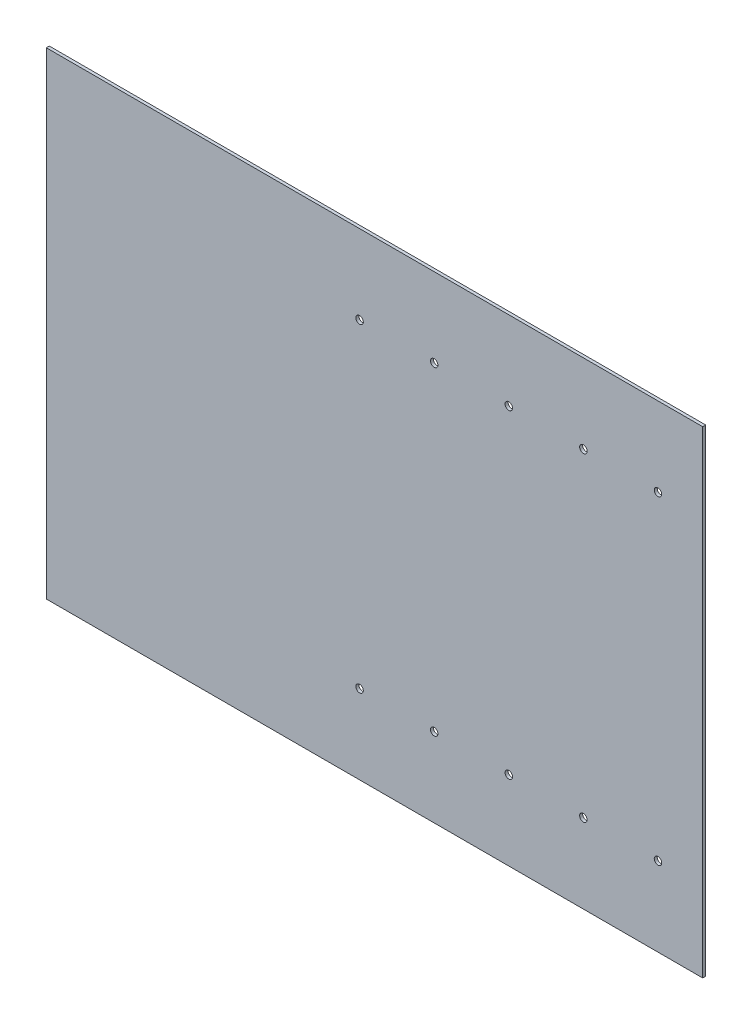
ISO-10303-21;
HEADER;
FILE_DESCRIPTION(('STEP AP214'),'2;1');
FILE_NAME('part.step','',(''),(''),'','','');
FILE_SCHEMA(('AUTOMOTIVE_DESIGN { 1 0 10303 214 1 1 1 1 }'));
ENDSEC;
DATA;
#1=APPLICATION_CONTEXT('core data for automotive mechanical design processes');
#2=APPLICATION_PROTOCOL_DEFINITION('international standard','automotive_design',2000,#1);
#3=PRODUCT_CONTEXT('',#1,'mechanical');
#4=PRODUCT('Part','Part','',(#3));
#5=PRODUCT_RELATED_PRODUCT_CATEGORY('part','',(#4));
#6=PRODUCT_DEFINITION_FORMATION('','',#4);
#7=PRODUCT_DEFINITION_CONTEXT('part definition',#1,'design');
#8=PRODUCT_DEFINITION('design','',#6,#7);
#9=PRODUCT_DEFINITION_SHAPE('','',#8);
#10=(LENGTH_UNIT() NAMED_UNIT(*) SI_UNIT(.MILLI.,.METRE.));
#11=(NAMED_UNIT(*) PLANE_ANGLE_UNIT() SI_UNIT($,.RADIAN.));
#12=(NAMED_UNIT(*) SI_UNIT($,.STERADIAN.) SOLID_ANGLE_UNIT());
#13=UNCERTAINTY_MEASURE_WITH_UNIT(LENGTH_MEASURE(1.E-05),#10,'distance_accuracy_value','');
#14=(GEOMETRIC_REPRESENTATION_CONTEXT(3) GLOBAL_UNCERTAINTY_ASSIGNED_CONTEXT((#13)) GLOBAL_UNIT_ASSIGNED_CONTEXT((#10,
#11,#12)) REPRESENTATION_CONTEXT('',''));
#15=CARTESIAN_POINT('',(0.,0.,0.));
#16=DIRECTION('',(0.,0.,1.));
#17=DIRECTION('',(1.,0.,0.));
#18=AXIS2_PLACEMENT_3D('',#15,#16,#17);
#19=CARTESIAN_POINT('',(220.,160.,2.));
#20=DIRECTION('',(-1.,0.,0.));
#21=DIRECTION('',(0.,-1.,0.));
#22=AXIS2_PLACEMENT_3D('',#19,#20,#21);
#23=PLANE('',#22);
#24=DIRECTION('',(0.,1.,0.));
#25=VECTOR('',#24,1.);
#26=CARTESIAN_POINT('',(220.,160.,0.));
#27=LINE('',#26,#25);
#28=CARTESIAN_POINT('',(220.,-160.,0.));
#29=VERTEX_POINT('',#28);
#30=CARTESIAN_POINT('',(220.,160.,0.));
#31=VERTEX_POINT('',#30);
#32=EDGE_CURVE('E110',#29,#31,#27,.T.);
#33=ORIENTED_EDGE('',*,*,#32,.T.);
#34=DIRECTION('',(0.,0.,-1.));
#35=VECTOR('',#34,1.);
#36=CARTESIAN_POINT('',(220.,160.,2.));
#37=LINE('',#36,#35);
#38=CARTESIAN_POINT('',(220.,160.,2.));
#39=VERTEX_POINT('',#38);
#40=EDGE_CURVE('E11',#39,#31,#37,.T.);
#41=ORIENTED_EDGE('',*,*,#40,.F.);
#42=DIRECTION('',(0.,1.,0.));
#43=VECTOR('',#42,1.);
#44=CARTESIAN_POINT('',(220.,160.,2.));
#45=LINE('',#44,#43);
#46=CARTESIAN_POINT('',(220.,-160.,2.));
#47=VERTEX_POINT('',#46);
#48=EDGE_CURVE('E93',#47,#39,#45,.T.);
#49=ORIENTED_EDGE('',*,*,#48,.F.);
#50=DIRECTION('',(0.,0.,-1.));
#51=VECTOR('',#50,1.);
#52=CARTESIAN_POINT('',(220.,-160.,2.));
#53=LINE('',#52,#51);
#54=EDGE_CURVE('E106',#47,#29,#53,.T.);
#55=ORIENTED_EDGE('',*,*,#54,.T.);
#56=EDGE_LOOP('',(#33,#41,#49,#55));
#57=FACE_BOUND('',#56,.T.);
#58=ADVANCED_FACE('F39',(#57),#23,.F.);
#59=CARTESIAN_POINT('',(-220.,160.,2.));
#60=DIRECTION('',(0.,-1.,0.));
#61=DIRECTION('',(0.,0.,-1.));
#62=AXIS2_PLACEMENT_3D('',#59,#60,#61);
#63=PLANE('',#62);
#64=DIRECTION('',(-1.,0.,0.));
#65=VECTOR('',#64,1.);
#66=CARTESIAN_POINT('',(-220.,160.,0.));
#67=LINE('',#66,#65);
#68=CARTESIAN_POINT('',(-220.,160.,0.));
#69=VERTEX_POINT('',#68);
#70=EDGE_CURVE('E98',#31,#69,#67,.T.);
#71=ORIENTED_EDGE('',*,*,#70,.T.);
#72=DIRECTION('',(0.,0.,-1.));
#73=VECTOR('',#72,1.);
#74=CARTESIAN_POINT('',(-220.,160.,2.));
#75=LINE('',#74,#73);
#76=CARTESIAN_POINT('',(-220.,160.,2.));
#77=VERTEX_POINT('',#76);
#78=EDGE_CURVE('E49',#77,#69,#75,.T.);
#79=ORIENTED_EDGE('',*,*,#78,.F.);
#80=DIRECTION('',(-1.,0.,0.));
#81=VECTOR('',#80,1.);
#82=CARTESIAN_POINT('',(-220.,160.,2.));
#83=LINE('',#82,#81);
#84=EDGE_CURVE('E88',#39,#77,#83,.T.);
#85=ORIENTED_EDGE('',*,*,#84,.F.);
#86=ORIENTED_EDGE('',*,*,#40,.T.);
#87=EDGE_LOOP('',(#71,#79,#85,#86));
#88=FACE_BOUND('',#87,.T.);
#89=ADVANCED_FACE('F97',(#88),#63,.F.);
#90=CARTESIAN_POINT('',(-220.,160.,2.));
#91=DIRECTION('',(1.,0.,0.));
#92=DIRECTION('',(0.,0.,-1.));
#93=AXIS2_PLACEMENT_3D('',#90,#91,#92);
#94=PLANE('',#93);
#95=DIRECTION('',(0.,-1.,0.));
#96=VECTOR('',#95,1.);
#97=CARTESIAN_POINT('',(-220.,160.,0.));
#98=LINE('',#97,#96);
#99=CARTESIAN_POINT('',(-220.,-160.,0.));
#100=VERTEX_POINT('',#99);
#101=EDGE_CURVE('E75',#69,#100,#98,.T.);
#102=ORIENTED_EDGE('',*,*,#101,.T.);
#103=DIRECTION('',(0.,0.,-1.));
#104=VECTOR('',#103,1.);
#105=CARTESIAN_POINT('',(-220.,-160.,2.));
#106=LINE('',#105,#104);
#107=CARTESIAN_POINT('',(-220.,-160.,2.));
#108=VERTEX_POINT('',#107);
#109=EDGE_CURVE('E100',#108,#100,#106,.T.);
#110=ORIENTED_EDGE('',*,*,#109,.F.);
#111=DIRECTION('',(0.,-1.,0.));
#112=VECTOR('',#111,1.);
#113=CARTESIAN_POINT('',(-220.,160.,2.));
#114=LINE('',#113,#112);
#115=EDGE_CURVE('E91',#77,#108,#114,.T.);
#116=ORIENTED_EDGE('',*,*,#115,.F.);
#117=ORIENTED_EDGE('',*,*,#78,.T.);
#118=EDGE_LOOP('',(#102,#110,#116,#117));
#119=FACE_BOUND('',#118,.T.);
#120=ADVANCED_FACE('F102',(#119),#94,.F.);
#121=CARTESIAN_POINT('',(-220.,-160.,2.));
#122=DIRECTION('',(0.,1.,0.));
#123=DIRECTION('',(0.,0.,1.));
#124=AXIS2_PLACEMENT_3D('',#121,#122,#123);
#125=PLANE('',#124);
#126=DIRECTION('',(1.,0.,0.));
#127=VECTOR('',#126,1.);
#128=CARTESIAN_POINT('',(-220.,-160.,0.));
#129=LINE('',#128,#127);
#130=EDGE_CURVE('E81',#100,#29,#129,.T.);
#131=ORIENTED_EDGE('',*,*,#130,.T.);
#132=ORIENTED_EDGE('',*,*,#54,.F.);
#133=DIRECTION('',(1.,0.,0.));
#134=VECTOR('',#133,1.);
#135=CARTESIAN_POINT('',(-220.,-160.,2.));
#136=LINE('',#135,#134);
#137=EDGE_CURVE('E58',#108,#47,#136,.T.);
#138=ORIENTED_EDGE('',*,*,#137,.F.);
#139=ORIENTED_EDGE('',*,*,#109,.T.);
#140=EDGE_LOOP('',(#131,#132,#138,#139));
#141=FACE_BOUND('',#140,.T.);
#142=ADVANCED_FACE('F196',(#141),#125,.F.);
#143=CARTESIAN_POINT('',(0.,0.,2.));
#144=DIRECTION('',(0.,0.,1.));
#145=DIRECTION('',(1.,0.,0.));
#146=AXIS2_PLACEMENT_3D('',#143,#144,#145);
#147=PLANE('',#146);
#148=CARTESIAN_POINT('',(190.,-107.000000000001,2.));
#149=DIRECTION('',(0.,0.,1.));
#150=DIRECTION('',(-1.,0.,0.));
#151=AXIS2_PLACEMENT_3D('',#148,#149,#150);
#152=CIRCLE('',#151,2.5);
#153=CARTESIAN_POINT('',(187.5,-107.000000000001,2.));
#154=VERTEX_POINT('',#153);
#155=EDGE_CURVE('E345',#154,#154,#152,.T.);
#156=ORIENTED_EDGE('',*,*,#155,.F.);
#157=EDGE_LOOP('',(#156));
#158=FACE_BOUND('',#157,.T.);
#159=CARTESIAN_POINT('',(140.,-107.000000000001,2.));
#160=DIRECTION('',(0.,0.,1.));
#161=DIRECTION('',(-1.,0.,0.));
#162=AXIS2_PLACEMENT_3D('',#159,#160,#161);
#163=CIRCLE('',#162,2.5);
#164=CARTESIAN_POINT('',(137.5,-107.000000000001,2.));
#165=VERTEX_POINT('',#164);
#166=EDGE_CURVE('E337',#165,#165,#163,.T.);
#167=ORIENTED_EDGE('',*,*,#166,.F.);
#168=EDGE_LOOP('',(#167));
#169=FACE_BOUND('',#168,.T.);
#170=CARTESIAN_POINT('',(90.,-107.000000000001,2.));
#171=DIRECTION('',(0.,0.,1.));
#172=DIRECTION('',(-1.,0.,0.));
#173=AXIS2_PLACEMENT_3D('',#170,#171,#172);
#174=CIRCLE('',#173,2.5);
#175=CARTESIAN_POINT('',(87.5,-107.000000000001,2.));
#176=VERTEX_POINT('',#175);
#177=EDGE_CURVE('E310',#176,#176,#174,.T.);
#178=ORIENTED_EDGE('',*,*,#177,.F.);
#179=EDGE_LOOP('',(#178));
#180=FACE_BOUND('',#179,.T.);
#181=CARTESIAN_POINT('',(40.,-107.,2.));
#182=DIRECTION('',(0.,0.,1.));
#183=DIRECTION('',(-1.,0.,0.));
#184=AXIS2_PLACEMENT_3D('',#181,#182,#183);
#185=CIRCLE('',#184,2.5);
#186=CARTESIAN_POINT('',(37.5,-107.,2.));
#187=VERTEX_POINT('',#186);
#188=EDGE_CURVE('E336',#187,#187,#185,.T.);
#189=ORIENTED_EDGE('',*,*,#188,.F.);
#190=EDGE_LOOP('',(#189));
#191=FACE_BOUND('',#190,.T.);
#192=CARTESIAN_POINT('',(-10.,-107.,2.));
#193=DIRECTION('',(0.,0.,1.));
#194=DIRECTION('',(-1.,0.,0.));
#195=AXIS2_PLACEMENT_3D('',#192,#193,#194);
#196=CIRCLE('',#195,2.5);
#197=CARTESIAN_POINT('',(-12.5,-107.,2.));
#198=VERTEX_POINT('',#197);
#199=EDGE_CURVE('E342',#198,#198,#196,.T.);
#200=ORIENTED_EDGE('',*,*,#199,.F.);
#201=EDGE_LOOP('',(#200));
#202=FACE_BOUND('',#201,.T.);
#203=CARTESIAN_POINT('',(-10.,107.,2.));
#204=DIRECTION('',(0.,0.,1.));
#205=DIRECTION('',(1.,0.,0.));
#206=AXIS2_PLACEMENT_3D('',#203,#204,#205);
#207=CIRCLE('',#206,2.5);
#208=CARTESIAN_POINT('',(-7.50000000000001,107.,2.));
#209=VERTEX_POINT('',#208);
#210=EDGE_CURVE('E369',#209,#209,#207,.T.);
#211=ORIENTED_EDGE('',*,*,#210,.F.);
#212=EDGE_LOOP('',(#211));
#213=FACE_BOUND('',#212,.T.);
#214=CARTESIAN_POINT('',(40.,107.,2.));
#215=DIRECTION('',(0.,0.,1.));
#216=DIRECTION('',(1.,0.,0.));
#217=AXIS2_PLACEMENT_3D('',#214,#215,#216);
#218=CIRCLE('',#217,2.5);
#219=CARTESIAN_POINT('',(42.5,107.,2.));
#220=VERTEX_POINT('',#219);
#221=EDGE_CURVE('E363',#220,#220,#218,.T.);
#222=ORIENTED_EDGE('',*,*,#221,.F.);
#223=EDGE_LOOP('',(#222));
#224=FACE_BOUND('',#223,.T.);
#225=CARTESIAN_POINT('',(90.,107.000000000001,2.));
#226=DIRECTION('',(0.,0.,1.));
#227=DIRECTION('',(1.,0.,0.));
#228=AXIS2_PLACEMENT_3D('',#225,#226,#227);
#229=CIRCLE('',#228,2.5);
#230=CARTESIAN_POINT('',(92.5,107.000000000001,2.));
#231=VERTEX_POINT('',#230);
#232=EDGE_CURVE('E358',#231,#231,#229,.T.);
#233=ORIENTED_EDGE('',*,*,#232,.F.);
#234=EDGE_LOOP('',(#233));
#235=FACE_BOUND('',#234,.T.);
#236=CARTESIAN_POINT('',(140.,107.000000000001,2.));
#237=DIRECTION('',(0.,0.,1.));
#238=DIRECTION('',(1.,0.,0.));
#239=AXIS2_PLACEMENT_3D('',#236,#237,#238);
#240=CIRCLE('',#239,2.5);
#241=CARTESIAN_POINT('',(142.5,107.000000000001,2.));
#242=VERTEX_POINT('',#241);
#243=EDGE_CURVE('E353',#242,#242,#240,.T.);
#244=ORIENTED_EDGE('',*,*,#243,.F.);
#245=EDGE_LOOP('',(#244));
#246=FACE_BOUND('',#245,.T.);
#247=CARTESIAN_POINT('',(190.,107.000000000001,2.));
#248=DIRECTION('',(0.,0.,1.));
#249=DIRECTION('',(1.,0.,0.));
#250=AXIS2_PLACEMENT_3D('',#247,#248,#249);
#251=CIRCLE('',#250,2.49999999999994);
#252=CARTESIAN_POINT('',(192.5,107.000000000001,2.));
#253=VERTEX_POINT('',#252);
#254=EDGE_CURVE('E129',#253,#253,#251,.T.);
#255=ORIENTED_EDGE('',*,*,#254,.F.);
#256=EDGE_LOOP('',(#255));
#257=FACE_BOUND('',#256,.T.);
#258=ORIENTED_EDGE('',*,*,#48,.T.);
#259=ORIENTED_EDGE('',*,*,#84,.T.);
#260=ORIENTED_EDGE('',*,*,#115,.T.);
#261=ORIENTED_EDGE('',*,*,#137,.T.);
#262=EDGE_LOOP('',(#258,#259,#260,#261));
#263=FACE_BOUND('',#262,.T.);
#264=ADVANCED_FACE('F89',(#158,#169,#180,#191,#202,#213,#224,#235,#246,#257,#263),#147,.T.);
#265=CARTESIAN_POINT('',(0.,0.,0.));
#266=DIRECTION('',(0.,0.,1.));
#267=DIRECTION('',(1.,0.,0.));
#268=AXIS2_PLACEMENT_3D('',#265,#266,#267);
#269=PLANE('',#268);
#270=CARTESIAN_POINT('',(190.,-107.000000000001,0.));
#271=DIRECTION('',(0.,0.,1.));
#272=DIRECTION('',(1.,0.,0.));
#273=AXIS2_PLACEMENT_3D('',#270,#271,#272);
#274=CIRCLE('',#273,2.5);
#275=CARTESIAN_POINT('',(192.5,-107.000000000001,0.));
#276=VERTEX_POINT('',#275);
#277=EDGE_CURVE('E42',#276,#276,#274,.T.);
#278=ORIENTED_EDGE('',*,*,#277,.T.);
#279=EDGE_LOOP('',(#278));
#280=FACE_BOUND('',#279,.T.);
#281=CARTESIAN_POINT('',(140.,-107.000000000001,0.));
#282=DIRECTION('',(0.,0.,1.));
#283=DIRECTION('',(1.,0.,0.));
#284=AXIS2_PLACEMENT_3D('',#281,#282,#283);
#285=CIRCLE('',#284,2.5);
#286=CARTESIAN_POINT('',(142.5,-107.000000000001,0.));
#287=VERTEX_POINT('',#286);
#288=EDGE_CURVE('E156',#287,#287,#285,.T.);
#289=ORIENTED_EDGE('',*,*,#288,.T.);
#290=EDGE_LOOP('',(#289));
#291=FACE_BOUND('',#290,.T.);
#292=CARTESIAN_POINT('',(90.,-107.000000000001,0.));
#293=DIRECTION('',(0.,0.,1.));
#294=DIRECTION('',(1.,0.,0.));
#295=AXIS2_PLACEMENT_3D('',#292,#293,#294);
#296=CIRCLE('',#295,2.5);
#297=CARTESIAN_POINT('',(92.5,-107.000000000001,0.));
#298=VERTEX_POINT('',#297);
#299=EDGE_CURVE('E153',#298,#298,#296,.T.);
#300=ORIENTED_EDGE('',*,*,#299,.T.);
#301=EDGE_LOOP('',(#300));
#302=FACE_BOUND('',#301,.T.);
#303=CARTESIAN_POINT('',(40.,-107.,0.));
#304=DIRECTION('',(0.,0.,1.));
#305=DIRECTION('',(1.,0.,0.));
#306=AXIS2_PLACEMENT_3D('',#303,#304,#305);
#307=CIRCLE('',#306,2.5);
#308=CARTESIAN_POINT('',(42.5,-107.,0.));
#309=VERTEX_POINT('',#308);
#310=EDGE_CURVE('E149',#309,#309,#307,.T.);
#311=ORIENTED_EDGE('',*,*,#310,.T.);
#312=EDGE_LOOP('',(#311));
#313=FACE_BOUND('',#312,.T.);
#314=CARTESIAN_POINT('',(-10.,-107.,0.));
#315=DIRECTION('',(0.,0.,1.));
#316=DIRECTION('',(1.,0.,0.));
#317=AXIS2_PLACEMENT_3D('',#314,#315,#316);
#318=CIRCLE('',#317,2.5);
#319=CARTESIAN_POINT('',(-7.50000000000001,-107.,0.));
#320=VERTEX_POINT('',#319);
#321=EDGE_CURVE('E145',#320,#320,#318,.T.);
#322=ORIENTED_EDGE('',*,*,#321,.T.);
#323=EDGE_LOOP('',(#322));
#324=FACE_BOUND('',#323,.T.);
#325=CARTESIAN_POINT('',(-10.,107.,0.));
#326=DIRECTION('',(0.,0.,1.));
#327=DIRECTION('',(1.,0.,0.));
#328=AXIS2_PLACEMENT_3D('',#325,#326,#327);
#329=CIRCLE('',#328,2.5);
#330=CARTESIAN_POINT('',(-7.50000000000001,107.,0.));
#331=VERTEX_POINT('',#330);
#332=EDGE_CURVE('E141',#331,#331,#329,.T.);
#333=ORIENTED_EDGE('',*,*,#332,.T.);
#334=EDGE_LOOP('',(#333));
#335=FACE_BOUND('',#334,.T.);
#336=CARTESIAN_POINT('',(40.,107.,0.));
#337=DIRECTION('',(0.,0.,1.));
#338=DIRECTION('',(1.,0.,0.));
#339=AXIS2_PLACEMENT_3D('',#336,#337,#338);
#340=CIRCLE('',#339,2.5);
#341=CARTESIAN_POINT('',(42.5,107.,0.));
#342=VERTEX_POINT('',#341);
#343=EDGE_CURVE('E137',#342,#342,#340,.T.);
#344=ORIENTED_EDGE('',*,*,#343,.T.);
#345=EDGE_LOOP('',(#344));
#346=FACE_BOUND('',#345,.T.);
#347=CARTESIAN_POINT('',(90.,107.000000000001,0.));
#348=DIRECTION('',(0.,0.,1.));
#349=DIRECTION('',(1.,0.,0.));
#350=AXIS2_PLACEMENT_3D('',#347,#348,#349);
#351=CIRCLE('',#350,2.5);
#352=CARTESIAN_POINT('',(92.5,107.000000000001,0.));
#353=VERTEX_POINT('',#352);
#354=EDGE_CURVE('E133',#353,#353,#351,.T.);
#355=ORIENTED_EDGE('',*,*,#354,.T.);
#356=EDGE_LOOP('',(#355));
#357=FACE_BOUND('',#356,.T.);
#358=CARTESIAN_POINT('',(140.,107.000000000001,0.));
#359=DIRECTION('',(0.,0.,1.));
#360=DIRECTION('',(1.,0.,0.));
#361=AXIS2_PLACEMENT_3D('',#358,#359,#360);
#362=CIRCLE('',#361,2.5);
#363=CARTESIAN_POINT('',(142.5,107.000000000001,0.));
#364=VERTEX_POINT('',#363);
#365=EDGE_CURVE('E128',#364,#364,#362,.T.);
#366=ORIENTED_EDGE('',*,*,#365,.T.);
#367=EDGE_LOOP('',(#366));
#368=FACE_BOUND('',#367,.T.);
#369=CARTESIAN_POINT('',(190.,107.000000000001,0.));
#370=DIRECTION('',(0.,0.,1.));
#371=DIRECTION('',(1.,0.,0.));
#372=AXIS2_PLACEMENT_3D('',#369,#370,#371);
#373=CIRCLE('',#372,2.49999999999994);
#374=CARTESIAN_POINT('',(192.5,107.000000000001,0.));
#375=VERTEX_POINT('',#374);
#376=EDGE_CURVE('E124',#375,#375,#373,.T.);
#377=ORIENTED_EDGE('',*,*,#376,.T.);
#378=EDGE_LOOP('',(#377));
#379=FACE_BOUND('',#378,.T.);
#380=ORIENTED_EDGE('',*,*,#32,.F.);
#381=ORIENTED_EDGE('',*,*,#130,.F.);
#382=ORIENTED_EDGE('',*,*,#101,.F.);
#383=ORIENTED_EDGE('',*,*,#70,.F.);
#384=EDGE_LOOP('',(#380,#381,#382,#383));
#385=FACE_BOUND('',#384,.T.);
#386=ADVANCED_FACE('F165',(#280,#291,#302,#313,#324,#335,#346,#357,#368,#379,#385),#269,.F.);
#387=CARTESIAN_POINT('',(190.,107.000000000001,-8.));
#388=DIRECTION('',(0.,0.,1.));
#389=DIRECTION('',(1.,0.,0.));
#390=AXIS2_PLACEMENT_3D('',#387,#388,#389);
#391=CYLINDRICAL_SURFACE('',#390,2.49999999999994);
#392=ORIENTED_EDGE('',*,*,#254,.T.);
#393=EDGE_LOOP('',(#392));
#394=FACE_BOUND('',#393,.T.);
#395=ORIENTED_EDGE('',*,*,#376,.F.);
#396=EDGE_LOOP('',(#395));
#397=FACE_BOUND('',#396,.T.);
#398=ADVANCED_FACE('F188',(#394,#397),#391,.F.);
#399=CARTESIAN_POINT('',(140.,107.000000000001,-8.));
#400=DIRECTION('',(0.,0.,1.));
#401=DIRECTION('',(1.,0.,0.));
#402=AXIS2_PLACEMENT_3D('',#399,#400,#401);
#403=CYLINDRICAL_SURFACE('',#402,2.5);
#404=ORIENTED_EDGE('',*,*,#243,.T.);
#405=EDGE_LOOP('',(#404));
#406=FACE_BOUND('',#405,.T.);
#407=ORIENTED_EDGE('',*,*,#365,.F.);
#408=EDGE_LOOP('',(#407));
#409=FACE_BOUND('',#408,.T.);
#410=ADVANCED_FACE('F194',(#406,#409),#403,.F.);
#411=CARTESIAN_POINT('',(90.,107.000000000001,-8.));
#412=DIRECTION('',(0.,0.,1.));
#413=DIRECTION('',(1.,0.,0.));
#414=AXIS2_PLACEMENT_3D('',#411,#412,#413);
#415=CYLINDRICAL_SURFACE('',#414,2.5);
#416=ORIENTED_EDGE('',*,*,#232,.T.);
#417=EDGE_LOOP('',(#416));
#418=FACE_BOUND('',#417,.T.);
#419=ORIENTED_EDGE('',*,*,#354,.F.);
#420=EDGE_LOOP('',(#419));
#421=FACE_BOUND('',#420,.T.);
#422=ADVANCED_FACE('F234',(#418,#421),#415,.F.);
#423=CARTESIAN_POINT('',(40.,107.,-8.));
#424=DIRECTION('',(0.,0.,1.));
#425=DIRECTION('',(1.,0.,0.));
#426=AXIS2_PLACEMENT_3D('',#423,#424,#425);
#427=CYLINDRICAL_SURFACE('',#426,2.5);
#428=ORIENTED_EDGE('',*,*,#221,.T.);
#429=EDGE_LOOP('',(#428));
#430=FACE_BOUND('',#429,.T.);
#431=ORIENTED_EDGE('',*,*,#343,.F.);
#432=EDGE_LOOP('',(#431));
#433=FACE_BOUND('',#432,.T.);
#434=ADVANCED_FACE('F244',(#430,#433),#427,.F.);
#435=CARTESIAN_POINT('',(-10.,107.,-8.));
#436=DIRECTION('',(0.,0.,1.));
#437=DIRECTION('',(1.,0.,0.));
#438=AXIS2_PLACEMENT_3D('',#435,#436,#437);
#439=CYLINDRICAL_SURFACE('',#438,2.5);
#440=ORIENTED_EDGE('',*,*,#210,.T.);
#441=EDGE_LOOP('',(#440));
#442=FACE_BOUND('',#441,.T.);
#443=ORIENTED_EDGE('',*,*,#332,.F.);
#444=EDGE_LOOP('',(#443));
#445=FACE_BOUND('',#444,.T.);
#446=ADVANCED_FACE('F254',(#442,#445),#439,.F.);
#447=CARTESIAN_POINT('',(-10.,-107.,-8.));
#448=DIRECTION('',(0.,0.,1.));
#449=DIRECTION('',(1.,0.,0.));
#450=AXIS2_PLACEMENT_3D('',#447,#448,#449);
#451=CYLINDRICAL_SURFACE('',#450,2.5);
#452=ORIENTED_EDGE('',*,*,#199,.T.);
#453=EDGE_LOOP('',(#452));
#454=FACE_BOUND('',#453,.T.);
#455=ORIENTED_EDGE('',*,*,#321,.F.);
#456=EDGE_LOOP('',(#455));
#457=FACE_BOUND('',#456,.T.);
#458=ADVANCED_FACE('F264',(#454,#457),#451,.F.);
#459=CARTESIAN_POINT('',(40.,-107.,-8.));
#460=DIRECTION('',(0.,0.,1.));
#461=DIRECTION('',(1.,0.,0.));
#462=AXIS2_PLACEMENT_3D('',#459,#460,#461);
#463=CYLINDRICAL_SURFACE('',#462,2.5);
#464=ORIENTED_EDGE('',*,*,#188,.T.);
#465=EDGE_LOOP('',(#464));
#466=FACE_BOUND('',#465,.T.);
#467=ORIENTED_EDGE('',*,*,#310,.F.);
#468=EDGE_LOOP('',(#467));
#469=FACE_BOUND('',#468,.T.);
#470=ADVANCED_FACE('F274',(#466,#469),#463,.F.);
#471=CARTESIAN_POINT('',(90.,-107.000000000001,-8.));
#472=DIRECTION('',(0.,0.,1.));
#473=DIRECTION('',(1.,0.,0.));
#474=AXIS2_PLACEMENT_3D('',#471,#472,#473);
#475=CYLINDRICAL_SURFACE('',#474,2.5);
#476=ORIENTED_EDGE('',*,*,#177,.T.);
#477=EDGE_LOOP('',(#476));
#478=FACE_BOUND('',#477,.T.);
#479=ORIENTED_EDGE('',*,*,#299,.F.);
#480=EDGE_LOOP('',(#479));
#481=FACE_BOUND('',#480,.T.);
#482=ADVANCED_FACE('F175',(#478,#481),#475,.F.);
#483=CARTESIAN_POINT('',(140.,-107.000000000001,-8.));
#484=DIRECTION('',(0.,0.,1.));
#485=DIRECTION('',(1.,0.,0.));
#486=AXIS2_PLACEMENT_3D('',#483,#484,#485);
#487=CYLINDRICAL_SURFACE('',#486,2.5);
#488=ORIENTED_EDGE('',*,*,#166,.T.);
#489=EDGE_LOOP('',(#488));
#490=FACE_BOUND('',#489,.T.);
#491=ORIENTED_EDGE('',*,*,#288,.F.);
#492=EDGE_LOOP('',(#491));
#493=FACE_BOUND('',#492,.T.);
#494=ADVANCED_FACE('F169',(#490,#493),#487,.F.);
#495=CARTESIAN_POINT('',(190.,-107.000000000001,-8.));
#496=DIRECTION('',(0.,0.,1.));
#497=DIRECTION('',(1.,0.,0.));
#498=AXIS2_PLACEMENT_3D('',#495,#496,#497);
#499=CYLINDRICAL_SURFACE('',#498,2.5);
#500=ORIENTED_EDGE('',*,*,#155,.T.);
#501=EDGE_LOOP('',(#500));
#502=FACE_BOUND('',#501,.T.);
#503=ORIENTED_EDGE('',*,*,#277,.F.);
#504=EDGE_LOOP('',(#503));
#505=FACE_BOUND('',#504,.T.);
#506=ADVANCED_FACE('F167',(#502,#505),#499,.F.);
#507=CLOSED_SHELL('',(#58,#89,#120,#142,#264,#386,#398,#410,#422,#434,#446,#458,#470,#482,#494,#506));
#508=MANIFOLD_SOLID_BREP('B2',#507);
#509=ADVANCED_BREP_SHAPE_REPRESENTATION('',(#18,#508),#14);
#510=SHAPE_DEFINITION_REPRESENTATION(#9,#509);
ENDSEC;
END-ISO-10303-21;
